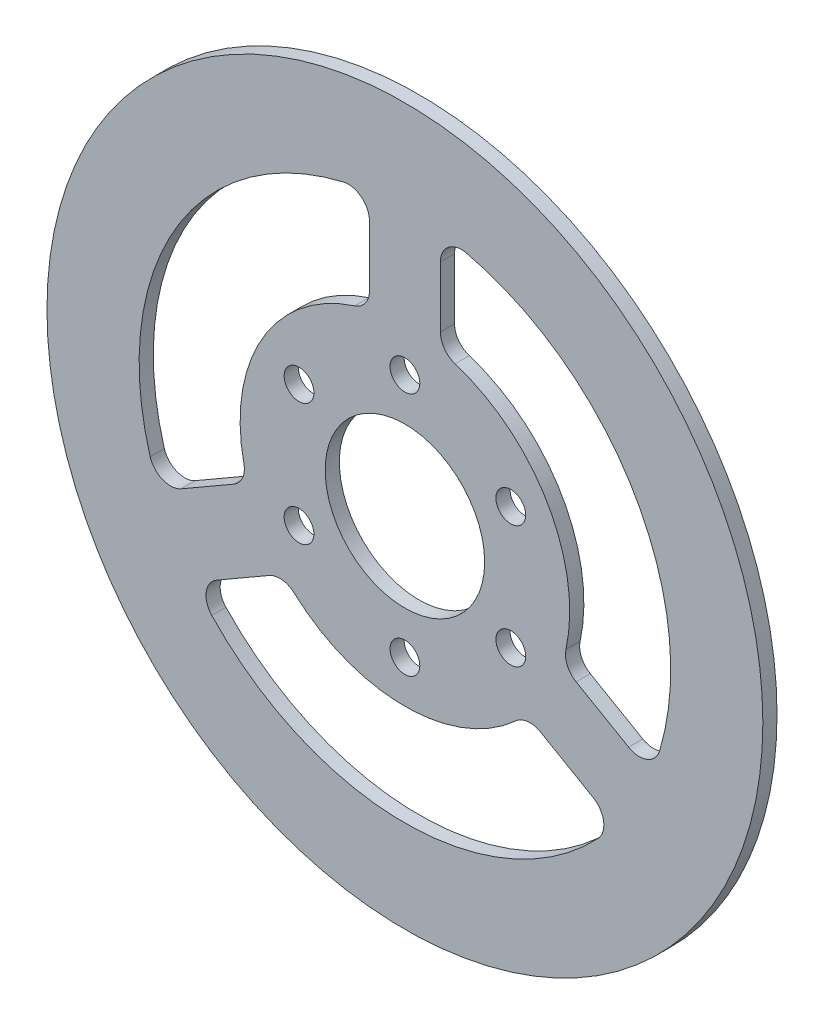
ISO-10303-21;
HEADER;
FILE_DESCRIPTION(('STEP AP214'),'2;1');
FILE_NAME('part.step','',(''),(''),'','','');
FILE_SCHEMA(('AUTOMOTIVE_DESIGN { 1 0 10303 214 1 1 1 1 }'));
ENDSEC;
DATA;
#1=APPLICATION_CONTEXT('core data for automotive mechanical design processes');
#2=APPLICATION_PROTOCOL_DEFINITION('international standard','automotive_design',2000,#1);
#3=PRODUCT_CONTEXT('',#1,'mechanical');
#4=PRODUCT('Part','Part','',(#3));
#5=PRODUCT_RELATED_PRODUCT_CATEGORY('part','',(#4));
#6=PRODUCT_DEFINITION_FORMATION('','',#4);
#7=PRODUCT_DEFINITION_CONTEXT('part definition',#1,'design');
#8=PRODUCT_DEFINITION('design','',#6,#7);
#9=PRODUCT_DEFINITION_SHAPE('','',#8);
#10=(LENGTH_UNIT() NAMED_UNIT(*) SI_UNIT(.MILLI.,.METRE.));
#11=(NAMED_UNIT(*) PLANE_ANGLE_UNIT() SI_UNIT($,.RADIAN.));
#12=(NAMED_UNIT(*) SI_UNIT($,.STERADIAN.) SOLID_ANGLE_UNIT());
#13=UNCERTAINTY_MEASURE_WITH_UNIT(LENGTH_MEASURE(1.E-05),#10,'distance_accuracy_value','');
#14=(GEOMETRIC_REPRESENTATION_CONTEXT(3) GLOBAL_UNCERTAINTY_ASSIGNED_CONTEXT((#13)) GLOBAL_UNIT_ASSIGNED_CONTEXT((#10,
#11,#12)) REPRESENTATION_CONTEXT('',''));
#15=CARTESIAN_POINT('',(0.,0.,0.));
#16=DIRECTION('',(0.,0.,1.));
#17=DIRECTION('',(1.,0.,0.));
#18=AXIS2_PLACEMENT_3D('',#15,#16,#17);
#19=CARTESIAN_POINT('',(0.,0.,2.));
#20=DIRECTION('',(0.,0.,1.));
#21=DIRECTION('',(1.,0.,0.));
#22=AXIS2_PLACEMENT_3D('',#19,#20,#21);
#23=PLANE('',#22);
#24=CARTESIAN_POINT('',(14.9389382152816,-8.62499999999999,2.));
#25=DIRECTION('',(0.,0.,1.));
#26=DIRECTION('',(1.,0.,0.));
#27=AXIS2_PLACEMENT_3D('',#24,#25,#26);
#28=CIRCLE('',#27,2.1);
#29=CARTESIAN_POINT('',(17.0389382152816,-8.62499999999999,2.));
#30=VERTEX_POINT('',#29);
#31=EDGE_CURVE('E709',#30,#30,#28,.T.);
#32=ORIENTED_EDGE('',*,*,#31,.F.);
#33=EDGE_LOOP('',(#32));
#34=FACE_BOUND('',#33,.T.);
#35=CARTESIAN_POINT('',(14.9389382152816,8.625,2.));
#36=DIRECTION('',(0.,0.,1.));
#37=DIRECTION('',(1.,0.,0.));
#38=AXIS2_PLACEMENT_3D('',#35,#36,#37);
#39=CIRCLE('',#38,2.1);
#40=CARTESIAN_POINT('',(17.0389382152816,8.625,2.));
#41=VERTEX_POINT('',#40);
#42=EDGE_CURVE('E712',#41,#41,#39,.T.);
#43=ORIENTED_EDGE('',*,*,#42,.F.);
#44=EDGE_LOOP('',(#43));
#45=FACE_BOUND('',#44,.T.);
#46=CARTESIAN_POINT('',(0.,17.25,2.));
#47=DIRECTION('',(0.,0.,1.));
#48=DIRECTION('',(1.,0.,0.));
#49=AXIS2_PLACEMENT_3D('',#46,#47,#48);
#50=CIRCLE('',#49,2.1);
#51=CARTESIAN_POINT('',(2.1,17.25,2.));
#52=VERTEX_POINT('',#51);
#53=EDGE_CURVE('E716',#52,#52,#50,.T.);
#54=ORIENTED_EDGE('',*,*,#53,.F.);
#55=EDGE_LOOP('',(#54));
#56=FACE_BOUND('',#55,.T.);
#57=CARTESIAN_POINT('',(-14.9389382152816,8.62499999999999,2.));
#58=DIRECTION('',(0.,0.,1.));
#59=DIRECTION('',(1.,0.,0.));
#60=AXIS2_PLACEMENT_3D('',#57,#58,#59);
#61=CIRCLE('',#60,2.1);
#62=CARTESIAN_POINT('',(-12.8389382152816,8.62499999999999,2.));
#63=VERTEX_POINT('',#62);
#64=EDGE_CURVE('E706',#63,#63,#61,.T.);
#65=ORIENTED_EDGE('',*,*,#64,.F.);
#66=EDGE_LOOP('',(#65));
#67=FACE_BOUND('',#66,.T.);
#68=CARTESIAN_POINT('',(0.,0.,2.));
#69=DIRECTION('',(0.,0.,1.));
#70=DIRECTION('',(1.,0.,0.));
#71=AXIS2_PLACEMENT_3D('',#68,#69,#70);
#72=CIRCLE('',#71,11.25);
#73=CARTESIAN_POINT('',(11.25,0.,2.));
#74=VERTEX_POINT('',#73);
#75=EDGE_CURVE('E698',#74,#74,#72,.T.);
#76=ORIENTED_EDGE('',*,*,#75,.F.);
#77=EDGE_LOOP('',(#76));
#78=FACE_BOUND('',#77,.T.);
#79=CARTESIAN_POINT('',(-14.9389382152816,-8.62500000000001,2.));
#80=DIRECTION('',(0.,0.,1.));
#81=DIRECTION('',(1.,0.,0.));
#82=AXIS2_PLACEMENT_3D('',#79,#80,#81);
#83=CIRCLE('',#82,2.1);
#84=CARTESIAN_POINT('',(-12.8389382152816,-8.62500000000001,2.));
#85=VERTEX_POINT('',#84);
#86=EDGE_CURVE('E703',#85,#85,#83,.T.);
#87=ORIENTED_EDGE('',*,*,#86,.F.);
#88=EDGE_LOOP('',(#87));
#89=FACE_BOUND('',#88,.T.);
#90=CARTESIAN_POINT('',(0.,-17.25,2.));
#91=DIRECTION('',(0.,0.,1.));
#92=DIRECTION('',(1.,0.,0.));
#93=AXIS2_PLACEMENT_3D('',#90,#91,#92);
#94=CIRCLE('',#93,2.1);
#95=CARTESIAN_POINT('',(2.1,-17.25,2.));
#96=VERTEX_POINT('',#95);
#97=EDGE_CURVE('E713',#96,#96,#94,.T.);
#98=ORIENTED_EDGE('',*,*,#97,.F.);
#99=EDGE_LOOP('',(#98));
#100=FACE_BOUND('',#99,.T.);
#101=CARTESIAN_POINT('',(0.,0.,2.));
#102=DIRECTION('',(0.,0.,1.));
#103=DIRECTION('',(1.,0.,0.));
#104=AXIS2_PLACEMENT_3D('',#101,#102,#103);
#105=CIRCLE('',#104,50.5);
#106=CARTESIAN_POINT('',(50.5,0.,2.));
#107=VERTEX_POINT('',#106);
#108=EDGE_CURVE('E476',#107,#107,#105,.T.);
#109=ORIENTED_EDGE('',*,*,#108,.T.);
#110=EDGE_LOOP('',(#109));
#111=FACE_BOUND('',#110,.T.);
#112=CARTESIAN_POINT('',(0.,0.,2.));
#113=DIRECTION('',(0.,0.,1.));
#114=DIRECTION('',(1.,0.,0.));
#115=AXIS2_PLACEMENT_3D('',#112,#113,#114);
#116=CIRCLE('',#115,37.5);
#117=CARTESIAN_POINT('',(-8.69565217391304,36.477878683804,2.));
#118=VERTEX_POINT('',#117);
#119=CARTESIAN_POINT('',(-35.9385957032976,-10.7082836568199,2.));
#120=VERTEX_POINT('',#119);
#121=EDGE_CURVE('E544',#118,#120,#116,.T.);
#122=ORIENTED_EDGE('',*,*,#121,.F.);
#123=CARTESIAN_POINT('',(-8.,33.5596483890997,2.));
#124=DIRECTION('',(0.,0.,1.));
#125=DIRECTION('',(1.,0.,0.));
#126=AXIS2_PLACEMENT_3D('',#123,#124,#125);
#127=CIRCLE('',#126,3.);
#128=CARTESIAN_POINT('',(-5.,33.5596483890997,2.));
#129=VERTEX_POINT('',#128);
#130=EDGE_CURVE('E347',#118,#129,#127,.F.);
#131=ORIENTED_EDGE('',*,*,#130,.T.);
#132=DIRECTION('',(0.,-1.,0.));
#133=VECTOR('',#132,1.);
#134=CARTESIAN_POINT('',(-5.,0.,2.));
#135=LINE('',#134,#133);
#136=CARTESIAN_POINT('',(-5.,25.0012499687516,2.));
#137=VERTEX_POINT('',#136);
#138=EDGE_CURVE('E541',#129,#137,#135,.T.);
#139=ORIENTED_EDGE('',*,*,#138,.T.);
#140=CARTESIAN_POINT('',(-8.,25.0012499687516,2.));
#141=DIRECTION('',(0.,0.,1.));
#142=DIRECTION('',(1.,0.,0.));
#143=AXIS2_PLACEMENT_3D('',#140,#141,#142);
#144=CIRCLE('',#143,3.);
#145=CARTESIAN_POINT('',(-7.08571428571429,22.1439642580371,2.));
#146=VERTEX_POINT('',#145);
#147=EDGE_CURVE('E329',#137,#146,#144,.F.);
#148=ORIENTED_EDGE('',*,*,#147,.T.);
#149=CARTESIAN_POINT('',(0.,0.,2.));
#150=DIRECTION('',(0.,0.,1.));
#151=DIRECTION('',(1.,0.,0.));
#152=AXIS2_PLACEMENT_3D('',#149,#150,#151);
#153=CIRCLE('',#152,23.25);
#154=CARTESIAN_POINT('',(-22.7200927308119,-4.93557355363168,2.));
#155=VERTEX_POINT('',#154);
#156=EDGE_CURVE('E501',#146,#155,#153,.T.);
#157=ORIENTED_EDGE('',*,*,#156,.T.);
#158=CARTESIAN_POINT('',(-25.6517175993038,-5.57242175410028,2.));
#159=DIRECTION('',(0.,0.,1.));
#160=DIRECTION('',(1.,0.,0.));
#161=AXIS2_PLACEMENT_3D('',#158,#159,#160);
#162=CIRCLE('',#161,3.);
#163=CARTESIAN_POINT('',(-24.1517175993038,-8.1704979654536,2.));
#164=VERTEX_POINT('',#163);
#165=EDGE_CURVE('E339',#155,#164,#162,.F.);
#166=ORIENTED_EDGE('',*,*,#165,.T.);
#167=DIRECTION('',(0.866025403784438,0.500000000000001,0.));
#168=VECTOR('',#167,1.);
#169=CARTESIAN_POINT('',(-2.50000000000001,4.3301270189222,2.));
#170=LINE('',#169,#168);
#171=CARTESIAN_POINT('',(-31.5635080470338,-12.4496971756277,2.));
#172=VERTEX_POINT('',#171);
#173=EDGE_CURVE('E548',#172,#164,#170,.T.);
#174=ORIENTED_EDGE('',*,*,#173,.F.);
#175=CARTESIAN_POINT('',(-33.0635080470338,-9.85162096427434,2.));
#176=DIRECTION('',(0.,0.,1.));
#177=DIRECTION('',(1.,0.,0.));
#178=AXIS2_PLACEMENT_3D('',#175,#176,#177);
#179=CIRCLE('',#178,3.);
#180=EDGE_CURVE('E343',#172,#120,#179,.F.);
#181=ORIENTED_EDGE('',*,*,#180,.T.);
#182=EDGE_LOOP('',(#122,#131,#139,#148,#157,#166,#174,#181));
#183=FACE_BOUND('',#182,.T.);
#184=CARTESIAN_POINT('',(0.,0.,2.));
#185=DIRECTION('',(0.,0.,1.));
#186=DIRECTION('',(1.,0.,0.));
#187=AXIS2_PLACEMENT_3D('',#184,#185,#186);
#188=CIRCLE('',#187,37.5);
#189=CARTESIAN_POINT('',(-27.2429435293846,-25.7695950269841,2.));
#190=VERTEX_POINT('',#189);
#191=CARTESIAN_POINT('',(27.2429435293846,-25.7695950269841,2.));
#192=VERTEX_POINT('',#191);
#193=EDGE_CURVE('E537',#190,#192,#188,.T.);
#194=ORIENTED_EDGE('',*,*,#193,.F.);
#195=CARTESIAN_POINT('',(-25.0635080470338,-23.7080274248254,2.));
#196=DIRECTION('',(0.,0.,1.));
#197=DIRECTION('',(1.,0.,0.));
#198=AXIS2_PLACEMENT_3D('',#195,#196,#197);
#199=CIRCLE('',#198,3.);
#200=CARTESIAN_POINT('',(-26.5635080470338,-21.109951213472,2.));
#201=VERTEX_POINT('',#200);
#202=EDGE_CURVE('E363',#190,#201,#199,.F.);
#203=ORIENTED_EDGE('',*,*,#202,.T.);
#204=DIRECTION('',(0.866025403784438,0.500000000000001,0.));
#205=VECTOR('',#204,1.);
#206=CARTESIAN_POINT('',(2.5,-4.33012701892218,2.));
#207=LINE('',#206,#205);
#208=CARTESIAN_POINT('',(-19.1517175993038,-16.830752003298,2.));
#209=VERTEX_POINT('',#208);
#210=EDGE_CURVE('E528',#201,#209,#207,.T.);
#211=ORIENTED_EDGE('',*,*,#210,.T.);
#212=CARTESIAN_POINT('',(-17.6517175993038,-19.4288282146513,2.));
#213=DIRECTION('',(0.,0.,1.));
#214=DIRECTION('',(1.,0.,0.));
#215=AXIS2_PLACEMENT_3D('',#212,#213,#214);
#216=CIRCLE('',#215,3.);
#217=CARTESIAN_POINT('',(-15.6343784450976,-17.2083907044054,2.));
#218=VERTEX_POINT('',#217);
#219=EDGE_CURVE('E351',#209,#218,#216,.F.);
#220=ORIENTED_EDGE('',*,*,#219,.T.);
#221=CARTESIAN_POINT('',(0.,0.,2.));
#222=DIRECTION('',(0.,0.,1.));
#223=DIRECTION('',(1.,0.,0.));
#224=AXIS2_PLACEMENT_3D('',#221,#222,#223);
#225=CIRCLE('',#224,23.25);
#226=CARTESIAN_POINT('',(15.6343784450976,-17.2083907044054,2.));
#227=VERTEX_POINT('',#226);
#228=EDGE_CURVE('E527',#218,#227,#225,.T.);
#229=ORIENTED_EDGE('',*,*,#228,.T.);
#230=CARTESIAN_POINT('',(17.6517175993038,-19.4288282146513,2.));
#231=DIRECTION('',(0.,0.,1.));
#232=DIRECTION('',(1.,0.,0.));
#233=AXIS2_PLACEMENT_3D('',#230,#231,#232);
#234=CIRCLE('',#233,3.);
#235=CARTESIAN_POINT('',(19.1517175993038,-16.830752003298,2.));
#236=VERTEX_POINT('',#235);
#237=EDGE_CURVE('E355',#227,#236,#234,.F.);
#238=ORIENTED_EDGE('',*,*,#237,.T.);
#239=DIRECTION('',(-0.866025403784439,0.5,0.));
#240=VECTOR('',#239,1.);
#241=CARTESIAN_POINT('',(-2.5,-4.3301270189222,2.));
#242=LINE('',#241,#240);
#243=CARTESIAN_POINT('',(26.5635080470338,-21.109951213472,2.));
#244=VERTEX_POINT('',#243);
#245=EDGE_CURVE('E533',#244,#236,#242,.T.);
#246=ORIENTED_EDGE('',*,*,#245,.F.);
#247=CARTESIAN_POINT('',(25.0635080470338,-23.7080274248253,2.));
#248=DIRECTION('',(0.,0.,1.));
#249=DIRECTION('',(1.,0.,0.));
#250=AXIS2_PLACEMENT_3D('',#247,#248,#249);
#251=CIRCLE('',#250,3.);
#252=EDGE_CURVE('E359',#244,#192,#251,.F.);
#253=ORIENTED_EDGE('',*,*,#252,.T.);
#254=EDGE_LOOP('',(#194,#203,#211,#220,#229,#238,#246,#253));
#255=FACE_BOUND('',#254,.T.);
#256=CARTESIAN_POINT('',(0.,0.,2.));
#257=DIRECTION('',(0.,0.,1.));
#258=DIRECTION('',(1.,0.,0.));
#259=AXIS2_PLACEMENT_3D('',#256,#257,#258);
#260=CIRCLE('',#259,37.5);
#261=CARTESIAN_POINT('',(35.9385957032976,-10.7082836568199,2.));
#262=VERTEX_POINT('',#261);
#263=CARTESIAN_POINT('',(8.69565217391304,36.477878683804,2.));
#264=VERTEX_POINT('',#263);
#265=EDGE_CURVE('E369',#262,#264,#260,.T.);
#266=ORIENTED_EDGE('',*,*,#265,.F.);
#267=CARTESIAN_POINT('',(33.0635080470338,-9.85162096427431,2.));
#268=DIRECTION('',(0.,0.,1.));
#269=DIRECTION('',(1.,0.,0.));
#270=AXIS2_PLACEMENT_3D('',#267,#268,#269);
#271=CIRCLE('',#270,3.);
#272=CARTESIAN_POINT('',(31.5635080470338,-12.4496971756276,2.));
#273=VERTEX_POINT('',#272);
#274=EDGE_CURVE('E330',#262,#273,#271,.F.);
#275=ORIENTED_EDGE('',*,*,#274,.T.);
#276=DIRECTION('',(-0.866025403784439,0.5,0.));
#277=VECTOR('',#276,1.);
#278=CARTESIAN_POINT('',(2.5,4.33012701892219,2.));
#279=LINE('',#278,#277);
#280=CARTESIAN_POINT('',(24.1517175993038,-8.17049796545358,2.));
#281=VERTEX_POINT('',#280);
#282=EDGE_CURVE('E310',#273,#281,#279,.T.);
#283=ORIENTED_EDGE('',*,*,#282,.T.);
#284=CARTESIAN_POINT('',(25.6517175993038,-5.57242175410026,2.));
#285=DIRECTION('',(0.,0.,1.));
#286=DIRECTION('',(1.,0.,0.));
#287=AXIS2_PLACEMENT_3D('',#284,#285,#286);
#288=CIRCLE('',#287,3.);
#289=CARTESIAN_POINT('',(22.7200927308119,-4.93557355363166,2.));
#290=VERTEX_POINT('',#289);
#291=EDGE_CURVE('E427',#281,#290,#288,.F.);
#292=ORIENTED_EDGE('',*,*,#291,.T.);
#293=CARTESIAN_POINT('',(0.,0.,2.));
#294=DIRECTION('',(0.,0.,1.));
#295=DIRECTION('',(1.,0.,0.));
#296=AXIS2_PLACEMENT_3D('',#293,#294,#295);
#297=CIRCLE('',#296,23.25);
#298=CARTESIAN_POINT('',(7.08571428571429,22.1439642580371,2.));
#299=VERTEX_POINT('',#298);
#300=EDGE_CURVE('E545',#290,#299,#297,.T.);
#301=ORIENTED_EDGE('',*,*,#300,.T.);
#302=CARTESIAN_POINT('',(8.,25.0012499687516,2.));
#303=DIRECTION('',(0.,0.,1.));
#304=DIRECTION('',(1.,0.,0.));
#305=AXIS2_PLACEMENT_3D('',#302,#303,#304);
#306=CIRCLE('',#305,3.);
#307=CARTESIAN_POINT('',(5.,25.0012499687516,2.));
#308=VERTEX_POINT('',#307);
#309=EDGE_CURVE('E430',#299,#308,#306,.F.);
#310=ORIENTED_EDGE('',*,*,#309,.T.);
#311=DIRECTION('',(0.,-1.,0.));
#312=VECTOR('',#311,1.);
#313=CARTESIAN_POINT('',(5.,0.,2.));
#314=LINE('',#313,#312);
#315=CARTESIAN_POINT('',(5.,33.5596483890997,2.));
#316=VERTEX_POINT('',#315);
#317=EDGE_CURVE('E371',#316,#308,#314,.T.);
#318=ORIENTED_EDGE('',*,*,#317,.F.);
#319=CARTESIAN_POINT('',(8.,33.5596483890997,2.));
#320=DIRECTION('',(0.,0.,1.));
#321=DIRECTION('',(1.,0.,0.));
#322=AXIS2_PLACEMENT_3D('',#319,#320,#321);
#323=CIRCLE('',#322,3.);
#324=EDGE_CURVE('E148',#316,#264,#323,.F.);
#325=ORIENTED_EDGE('',*,*,#324,.T.);
#326=EDGE_LOOP('',(#266,#275,#283,#292,#301,#310,#318,#325));
#327=FACE_BOUND('',#326,.T.);
#328=ADVANCED_FACE('F140',(#34,#45,#56,#67,#78,#89,#100,#111,#183,#255,#327),#23,.T.);
#329=CARTESIAN_POINT('',(0.,0.,0.));
#330=DIRECTION('',(0.,0.,1.));
#331=DIRECTION('',(1.,0.,0.));
#332=AXIS2_PLACEMENT_3D('',#329,#330,#331);
#333=PLANE('',#332);
#334=CARTESIAN_POINT('',(14.9389382152816,-8.62499999999999,0.));
#335=DIRECTION('',(0.,0.,1.));
#336=DIRECTION('',(1.,0.,0.));
#337=AXIS2_PLACEMENT_3D('',#334,#335,#336);
#338=CIRCLE('',#337,2.1);
#339=CARTESIAN_POINT('',(17.0389382152816,-8.62499999999999,0.));
#340=VERTEX_POINT('',#339);
#341=EDGE_CURVE('E470',#340,#340,#338,.T.);
#342=ORIENTED_EDGE('',*,*,#341,.T.);
#343=EDGE_LOOP('',(#342));
#344=FACE_BOUND('',#343,.T.);
#345=CARTESIAN_POINT('',(14.9389382152816,8.625,0.));
#346=DIRECTION('',(0.,0.,1.));
#347=DIRECTION('',(1.,0.,0.));
#348=AXIS2_PLACEMENT_3D('',#345,#346,#347);
#349=CIRCLE('',#348,2.1);
#350=CARTESIAN_POINT('',(17.0389382152816,8.625,0.));
#351=VERTEX_POINT('',#350);
#352=EDGE_CURVE('E467',#351,#351,#349,.T.);
#353=ORIENTED_EDGE('',*,*,#352,.T.);
#354=EDGE_LOOP('',(#353));
#355=FACE_BOUND('',#354,.T.);
#356=CARTESIAN_POINT('',(0.,17.25,0.));
#357=DIRECTION('',(0.,0.,1.));
#358=DIRECTION('',(1.,0.,0.));
#359=AXIS2_PLACEMENT_3D('',#356,#357,#358);
#360=CIRCLE('',#359,2.1);
#361=CARTESIAN_POINT('',(2.1,17.25,0.));
#362=VERTEX_POINT('',#361);
#363=EDGE_CURVE('E463',#362,#362,#360,.T.);
#364=ORIENTED_EDGE('',*,*,#363,.T.);
#365=EDGE_LOOP('',(#364));
#366=FACE_BOUND('',#365,.T.);
#367=CARTESIAN_POINT('',(-14.9389382152816,8.62499999999999,0.));
#368=DIRECTION('',(0.,0.,1.));
#369=DIRECTION('',(1.,0.,0.));
#370=AXIS2_PLACEMENT_3D('',#367,#368,#369);
#371=CIRCLE('',#370,2.1);
#372=CARTESIAN_POINT('',(-12.8389382152816,8.62499999999999,0.));
#373=VERTEX_POINT('',#372);
#374=EDGE_CURVE('E460',#373,#373,#371,.T.);
#375=ORIENTED_EDGE('',*,*,#374,.T.);
#376=EDGE_LOOP('',(#375));
#377=FACE_BOUND('',#376,.T.);
#378=DIRECTION('',(0.866025403784438,0.500000000000001,0.));
#379=VECTOR('',#378,1.);
#380=CARTESIAN_POINT('',(2.5,-4.33012701892218,0.));
#381=LINE('',#380,#379);
#382=CARTESIAN_POINT('',(-26.5635080470338,-21.109951213472,0.));
#383=VERTEX_POINT('',#382);
#384=CARTESIAN_POINT('',(-19.1517175993038,-16.830752003298,0.));
#385=VERTEX_POINT('',#384);
#386=EDGE_CURVE('E456',#383,#385,#381,.T.);
#387=ORIENTED_EDGE('',*,*,#386,.F.);
#388=CARTESIAN_POINT('',(-25.0635080470338,-23.7080274248254,0.));
#389=DIRECTION('',(0.,0.,1.));
#390=DIRECTION('',(1.,0.,0.));
#391=AXIS2_PLACEMENT_3D('',#388,#389,#390);
#392=CIRCLE('',#391,3.);
#393=CARTESIAN_POINT('',(-27.2429435293846,-25.7695950269841,0.));
#394=VERTEX_POINT('',#393);
#395=EDGE_CURVE('E162',#383,#394,#392,.T.);
#396=ORIENTED_EDGE('',*,*,#395,.T.);
#397=CARTESIAN_POINT('',(0.,0.,0.));
#398=DIRECTION('',(0.,0.,1.));
#399=DIRECTION('',(1.,0.,0.));
#400=AXIS2_PLACEMENT_3D('',#397,#398,#399);
#401=CIRCLE('',#400,37.5);
#402=CARTESIAN_POINT('',(27.2429435293846,-25.7695950269841,0.));
#403=VERTEX_POINT('',#402);
#404=EDGE_CURVE('E496',#394,#403,#401,.T.);
#405=ORIENTED_EDGE('',*,*,#404,.T.);
#406=CARTESIAN_POINT('',(25.0635080470338,-23.7080274248253,0.));
#407=DIRECTION('',(0.,0.,1.));
#408=DIRECTION('',(1.,0.,0.));
#409=AXIS2_PLACEMENT_3D('',#406,#407,#408);
#410=CIRCLE('',#409,3.);
#411=CARTESIAN_POINT('',(26.5635080470338,-21.109951213472,0.));
#412=VERTEX_POINT('',#411);
#413=EDGE_CURVE('E361',#403,#412,#410,.T.);
#414=ORIENTED_EDGE('',*,*,#413,.T.);
#415=DIRECTION('',(-0.866025403784439,0.5,0.));
#416=VECTOR('',#415,1.);
#417=CARTESIAN_POINT('',(-2.5,-4.3301270189222,0.));
#418=LINE('',#417,#416);
#419=CARTESIAN_POINT('',(19.1517175993038,-16.830752003298,0.));
#420=VERTEX_POINT('',#419);
#421=EDGE_CURVE('E507',#412,#420,#418,.T.);
#422=ORIENTED_EDGE('',*,*,#421,.T.);
#423=CARTESIAN_POINT('',(17.6517175993038,-19.4288282146513,0.));
#424=DIRECTION('',(0.,0.,1.));
#425=DIRECTION('',(1.,0.,0.));
#426=AXIS2_PLACEMENT_3D('',#423,#424,#425);
#427=CIRCLE('',#426,3.);
#428=CARTESIAN_POINT('',(15.6343784450976,-17.2083907044054,0.));
#429=VERTEX_POINT('',#428);
#430=EDGE_CURVE('E357',#420,#429,#427,.T.);
#431=ORIENTED_EDGE('',*,*,#430,.T.);
#432=CARTESIAN_POINT('',(0.,0.,0.));
#433=DIRECTION('',(0.,0.,1.));
#434=DIRECTION('',(1.,0.,0.));
#435=AXIS2_PLACEMENT_3D('',#432,#433,#434);
#436=CIRCLE('',#435,23.25);
#437=CARTESIAN_POINT('',(-15.6343784450976,-17.2083907044054,0.));
#438=VERTEX_POINT('',#437);
#439=EDGE_CURVE('E510',#438,#429,#436,.T.);
#440=ORIENTED_EDGE('',*,*,#439,.F.);
#441=CARTESIAN_POINT('',(-17.6517175993038,-19.4288282146513,0.));
#442=DIRECTION('',(0.,0.,1.));
#443=DIRECTION('',(1.,0.,0.));
#444=AXIS2_PLACEMENT_3D('',#441,#442,#443);
#445=CIRCLE('',#444,3.);
#446=EDGE_CURVE('E353',#438,#385,#445,.T.);
#447=ORIENTED_EDGE('',*,*,#446,.T.);
#448=EDGE_LOOP('',(#387,#396,#405,#414,#422,#431,#440,#447));
#449=FACE_BOUND('',#448,.T.);
#450=CARTESIAN_POINT('',(0.,0.,0.));
#451=DIRECTION('',(0.,0.,1.));
#452=DIRECTION('',(1.,0.,0.));
#453=AXIS2_PLACEMENT_3D('',#450,#451,#452);
#454=CIRCLE('',#453,11.25);
#455=CARTESIAN_POINT('',(11.25,0.,0.));
#456=VERTEX_POINT('',#455);
#457=EDGE_CURVE('E464',#456,#456,#454,.T.);
#458=ORIENTED_EDGE('',*,*,#457,.T.);
#459=EDGE_LOOP('',(#458));
#460=FACE_BOUND('',#459,.T.);
#461=CARTESIAN_POINT('',(-14.9389382152816,-8.62500000000001,0.));
#462=DIRECTION('',(0.,0.,1.));
#463=DIRECTION('',(1.,0.,0.));
#464=AXIS2_PLACEMENT_3D('',#461,#462,#463);
#465=CIRCLE('',#464,2.1);
#466=CARTESIAN_POINT('',(-12.8389382152816,-8.62500000000001,0.));
#467=VERTEX_POINT('',#466);
#468=EDGE_CURVE('E500',#467,#467,#465,.T.);
#469=ORIENTED_EDGE('',*,*,#468,.T.);
#470=EDGE_LOOP('',(#469));
#471=FACE_BOUND('',#470,.T.);
#472=CARTESIAN_POINT('',(0.,-17.25,0.));
#473=DIRECTION('',(0.,0.,1.));
#474=DIRECTION('',(1.,0.,0.));
#475=AXIS2_PLACEMENT_3D('',#472,#473,#474);
#476=CIRCLE('',#475,2.1);
#477=CARTESIAN_POINT('',(2.1,-17.25,0.));
#478=VERTEX_POINT('',#477);
#479=EDGE_CURVE('E497',#478,#478,#476,.T.);
#480=ORIENTED_EDGE('',*,*,#479,.T.);
#481=EDGE_LOOP('',(#480));
#482=FACE_BOUND('',#481,.T.);
#483=CARTESIAN_POINT('',(0.,0.,0.));
#484=DIRECTION('',(0.,0.,1.));
#485=DIRECTION('',(1.,0.,0.));
#486=AXIS2_PLACEMENT_3D('',#483,#484,#485);
#487=CIRCLE('',#486,50.5);
#488=CARTESIAN_POINT('',(50.5,0.,0.));
#489=VERTEX_POINT('',#488);
#490=EDGE_CURVE('E472',#489,#489,#487,.T.);
#491=ORIENTED_EDGE('',*,*,#490,.F.);
#492=EDGE_LOOP('',(#491));
#493=FACE_BOUND('',#492,.T.);
#494=DIRECTION('',(0.,-1.,0.));
#495=VECTOR('',#494,1.);
#496=CARTESIAN_POINT('',(-5.,0.,0.));
#497=LINE('',#496,#495);
#498=CARTESIAN_POINT('',(-5.,33.5596483890997,0.));
#499=VERTEX_POINT('',#498);
#500=CARTESIAN_POINT('',(-5.,25.0012499687516,0.));
#501=VERTEX_POINT('',#500);
#502=EDGE_CURVE('E493',#499,#501,#497,.T.);
#503=ORIENTED_EDGE('',*,*,#502,.F.);
#504=CARTESIAN_POINT('',(-8.,33.5596483890997,0.));
#505=DIRECTION('',(0.,0.,1.));
#506=DIRECTION('',(1.,0.,0.));
#507=AXIS2_PLACEMENT_3D('',#504,#505,#506);
#508=CIRCLE('',#507,3.);
#509=CARTESIAN_POINT('',(-8.69565217391304,36.477878683804,0.));
#510=VERTEX_POINT('',#509);
#511=EDGE_CURVE('E349',#499,#510,#508,.T.);
#512=ORIENTED_EDGE('',*,*,#511,.T.);
#513=CARTESIAN_POINT('',(0.,0.,0.));
#514=DIRECTION('',(0.,0.,1.));
#515=DIRECTION('',(1.,0.,0.));
#516=AXIS2_PLACEMENT_3D('',#513,#514,#515);
#517=CIRCLE('',#516,37.5);
#518=CARTESIAN_POINT('',(-35.9385957032976,-10.7082836568199,0.));
#519=VERTEX_POINT('',#518);
#520=EDGE_CURVE('E481',#510,#519,#517,.T.);
#521=ORIENTED_EDGE('',*,*,#520,.T.);
#522=CARTESIAN_POINT('',(-33.0635080470338,-9.85162096427434,0.));
#523=DIRECTION('',(0.,0.,1.));
#524=DIRECTION('',(1.,0.,0.));
#525=AXIS2_PLACEMENT_3D('',#522,#523,#524);
#526=CIRCLE('',#525,3.);
#527=CARTESIAN_POINT('',(-31.5635080470338,-12.4496971756277,0.));
#528=VERTEX_POINT('',#527);
#529=EDGE_CURVE('E345',#519,#528,#526,.T.);
#530=ORIENTED_EDGE('',*,*,#529,.T.);
#531=DIRECTION('',(0.866025403784438,0.500000000000001,0.));
#532=VECTOR('',#531,1.);
#533=CARTESIAN_POINT('',(-2.50000000000001,4.3301270189222,0.));
#534=LINE('',#533,#532);
#535=CARTESIAN_POINT('',(-24.1517175993038,-8.1704979654536,0.));
#536=VERTEX_POINT('',#535);
#537=EDGE_CURVE('E487',#528,#536,#534,.T.);
#538=ORIENTED_EDGE('',*,*,#537,.T.);
#539=CARTESIAN_POINT('',(-25.6517175993038,-5.57242175410028,0.));
#540=DIRECTION('',(0.,0.,1.));
#541=DIRECTION('',(1.,0.,0.));
#542=AXIS2_PLACEMENT_3D('',#539,#540,#541);
#543=CIRCLE('',#542,3.);
#544=CARTESIAN_POINT('',(-22.7200927308119,-4.93557355363168,0.));
#545=VERTEX_POINT('',#544);
#546=EDGE_CURVE('E341',#536,#545,#543,.T.);
#547=ORIENTED_EDGE('',*,*,#546,.T.);
#548=CARTESIAN_POINT('',(0.,0.,0.));
#549=DIRECTION('',(0.,0.,1.));
#550=DIRECTION('',(1.,0.,0.));
#551=AXIS2_PLACEMENT_3D('',#548,#549,#550);
#552=CIRCLE('',#551,23.25);
#553=CARTESIAN_POINT('',(-7.08571428571429,22.1439642580371,0.));
#554=VERTEX_POINT('',#553);
#555=EDGE_CURVE('E490',#554,#545,#552,.T.);
#556=ORIENTED_EDGE('',*,*,#555,.F.);
#557=CARTESIAN_POINT('',(-8.,25.0012499687516,0.));
#558=DIRECTION('',(0.,0.,1.));
#559=DIRECTION('',(1.,0.,0.));
#560=AXIS2_PLACEMENT_3D('',#557,#558,#559);
#561=CIRCLE('',#560,3.);
#562=EDGE_CURVE('E332',#554,#501,#561,.T.);
#563=ORIENTED_EDGE('',*,*,#562,.T.);
#564=EDGE_LOOP('',(#503,#512,#521,#530,#538,#547,#556,#563));
#565=FACE_BOUND('',#564,.T.);
#566=DIRECTION('',(-0.866025403784439,0.5,0.));
#567=VECTOR('',#566,1.);
#568=CARTESIAN_POINT('',(2.5,4.33012701892219,0.));
#569=LINE('',#568,#567);
#570=CARTESIAN_POINT('',(31.5635080470338,-12.4496971756276,0.));
#571=VERTEX_POINT('',#570);
#572=CARTESIAN_POINT('',(24.1517175993038,-8.17049796545358,0.));
#573=VERTEX_POINT('',#572);
#574=EDGE_CURVE('E307',#571,#573,#569,.T.);
#575=ORIENTED_EDGE('',*,*,#574,.F.);
#576=CARTESIAN_POINT('',(33.0635080470338,-9.85162096427431,0.));
#577=DIRECTION('',(0.,0.,1.));
#578=DIRECTION('',(1.,0.,0.));
#579=AXIS2_PLACEMENT_3D('',#576,#577,#578);
#580=CIRCLE('',#579,3.);
#581=CARTESIAN_POINT('',(35.9385957032976,-10.7082836568199,0.));
#582=VERTEX_POINT('',#581);
#583=EDGE_CURVE('E318',#571,#582,#580,.T.);
#584=ORIENTED_EDGE('',*,*,#583,.T.);
#585=CARTESIAN_POINT('',(0.,0.,0.));
#586=DIRECTION('',(0.,0.,1.));
#587=DIRECTION('',(1.,0.,0.));
#588=AXIS2_PLACEMENT_3D('',#585,#586,#587);
#589=CIRCLE('',#588,37.5);
#590=CARTESIAN_POINT('',(8.69565217391304,36.477878683804,0.));
#591=VERTEX_POINT('',#590);
#592=EDGE_CURVE('E454',#582,#591,#589,.T.);
#593=ORIENTED_EDGE('',*,*,#592,.T.);
#594=CARTESIAN_POINT('',(8.,33.5596483890997,0.));
#595=DIRECTION('',(0.,0.,1.));
#596=DIRECTION('',(1.,0.,0.));
#597=AXIS2_PLACEMENT_3D('',#594,#595,#596);
#598=CIRCLE('',#597,3.);
#599=CARTESIAN_POINT('',(5.,33.5596483890997,0.));
#600=VERTEX_POINT('',#599);
#601=EDGE_CURVE('E12',#591,#600,#598,.T.);
#602=ORIENTED_EDGE('',*,*,#601,.T.);
#603=DIRECTION('',(0.,-1.,0.));
#604=VECTOR('',#603,1.);
#605=CARTESIAN_POINT('',(5.,0.,0.));
#606=LINE('',#605,#604);
#607=CARTESIAN_POINT('',(5.,25.0012499687516,0.));
#608=VERTEX_POINT('',#607);
#609=EDGE_CURVE('E435',#600,#608,#606,.T.);
#610=ORIENTED_EDGE('',*,*,#609,.T.);
#611=CARTESIAN_POINT('',(8.,25.0012499687516,0.));
#612=DIRECTION('',(0.,0.,1.));
#613=DIRECTION('',(1.,0.,0.));
#614=AXIS2_PLACEMENT_3D('',#611,#612,#613);
#615=CIRCLE('',#614,3.);
#616=CARTESIAN_POINT('',(7.08571428571429,22.1439642580371,0.));
#617=VERTEX_POINT('',#616);
#618=EDGE_CURVE('E334',#608,#617,#615,.T.);
#619=ORIENTED_EDGE('',*,*,#618,.T.);
#620=CARTESIAN_POINT('',(0.,0.,0.));
#621=DIRECTION('',(0.,0.,1.));
#622=DIRECTION('',(1.,0.,0.));
#623=AXIS2_PLACEMENT_3D('',#620,#621,#622);
#624=CIRCLE('',#623,23.25);
#625=CARTESIAN_POINT('',(22.7200927308119,-4.93557355363166,0.));
#626=VERTEX_POINT('',#625);
#627=EDGE_CURVE('E323',#626,#617,#624,.T.);
#628=ORIENTED_EDGE('',*,*,#627,.F.);
#629=CARTESIAN_POINT('',(25.6517175993038,-5.57242175410026,0.));
#630=DIRECTION('',(0.,0.,1.));
#631=DIRECTION('',(1.,0.,0.));
#632=AXIS2_PLACEMENT_3D('',#629,#630,#631);
#633=CIRCLE('',#632,3.);
#634=EDGE_CURVE('E322',#626,#573,#633,.T.);
#635=ORIENTED_EDGE('',*,*,#634,.T.);
#636=EDGE_LOOP('',(#575,#584,#593,#602,#610,#619,#628,#635));
#637=FACE_BOUND('',#636,.T.);
#638=ADVANCED_FACE('F316',(#344,#355,#366,#377,#449,#460,#471,#482,#493,#565,#637),#333,.F.);
#639=CARTESIAN_POINT('',(0.,0.,2.));
#640=DIRECTION('',(0.,0.,-1.));
#641=DIRECTION('',(-1.,0.,0.));
#642=AXIS2_PLACEMENT_3D('',#639,#640,#641);
#643=CYLINDRICAL_SURFACE('',#642,50.5);
#644=ORIENTED_EDGE('',*,*,#108,.F.);
#645=EDGE_LOOP('',(#644));
#646=FACE_BOUND('',#645,.T.);
#647=ORIENTED_EDGE('',*,*,#490,.T.);
#648=EDGE_LOOP('',(#647));
#649=FACE_BOUND('',#648,.T.);
#650=ADVANCED_FACE('F603',(#646,#649),#643,.T.);
#651=CARTESIAN_POINT('',(-5.,0.,-8.));
#652=DIRECTION('',(-1.,0.,0.));
#653=DIRECTION('',(0.,-1.,0.));
#654=AXIS2_PLACEMENT_3D('',#651,#652,#653);
#655=PLANE('',#654);
#656=ORIENTED_EDGE('',*,*,#502,.T.);
#657=DIRECTION('',(0.,0.,-1.));
#658=VECTOR('',#657,1.);
#659=CARTESIAN_POINT('',(-5.,25.0012499687516,2.));
#660=LINE('',#659,#658);
#661=EDGE_CURVE('E390',#501,#137,#660,.F.);
#662=ORIENTED_EDGE('',*,*,#661,.T.);
#663=ORIENTED_EDGE('',*,*,#138,.F.);
#664=DIRECTION('',(0.,0.,1.));
#665=VECTOR('',#664,1.);
#666=CARTESIAN_POINT('',(-5.,33.5596483890997,-8.));
#667=LINE('',#666,#665);
#668=EDGE_CURVE('E383',#129,#499,#667,.F.);
#669=ORIENTED_EDGE('',*,*,#668,.T.);
#670=EDGE_LOOP('',(#656,#662,#663,#669));
#671=FACE_BOUND('',#670,.T.);
#672=ADVANCED_FACE('F568',(#671),#655,.T.);
#673=CARTESIAN_POINT('',(0.,0.,-8.));
#674=DIRECTION('',(0.,0.,1.));
#675=DIRECTION('',(1.,0.,0.));
#676=AXIS2_PLACEMENT_3D('',#673,#674,#675);
#677=CYLINDRICAL_SURFACE('',#676,23.25);
#678=ORIENTED_EDGE('',*,*,#156,.F.);
#679=DIRECTION('',(0.,0.,1.));
#680=VECTOR('',#679,1.);
#681=CARTESIAN_POINT('',(-7.08571428571429,22.1439642580371,-8.));
#682=LINE('',#681,#680);
#683=EDGE_CURVE('E396',#146,#554,#682,.F.);
#684=ORIENTED_EDGE('',*,*,#683,.T.);
#685=ORIENTED_EDGE('',*,*,#555,.T.);
#686=DIRECTION('',(0.,0.,1.));
#687=VECTOR('',#686,1.);
#688=CARTESIAN_POINT('',(-22.7200927308119,-4.93557355363167,-8.));
#689=LINE('',#688,#687);
#690=EDGE_CURVE('E393',#545,#155,#689,.T.);
#691=ORIENTED_EDGE('',*,*,#690,.T.);
#692=EDGE_LOOP('',(#678,#684,#685,#691));
#693=FACE_BOUND('',#692,.T.);
#694=ADVANCED_FACE('F557',(#693),#677,.T.);
#695=CARTESIAN_POINT('',(-2.50000000000001,4.3301270189222,-8.));
#696=DIRECTION('',(0.500000000000001,-0.866025403784438,0.));
#697=DIRECTION('',(0.866025403784438,0.500000000000001,0.));
#698=AXIS2_PLACEMENT_3D('',#695,#696,#697);
#699=PLANE('',#698);
#700=ORIENTED_EDGE('',*,*,#173,.T.);
#701=DIRECTION('',(0.,0.,1.));
#702=VECTOR('',#701,1.);
#703=CARTESIAN_POINT('',(-24.1517175993038,-8.17049796545359,-8.));
#704=LINE('',#703,#702);
#705=EDGE_CURVE('E401',#164,#536,#704,.F.);
#706=ORIENTED_EDGE('',*,*,#705,.T.);
#707=ORIENTED_EDGE('',*,*,#537,.F.);
#708=DIRECTION('',(0.,0.,-1.));
#709=VECTOR('',#708,1.);
#710=CARTESIAN_POINT('',(-31.5635080470338,-12.4496971756277,2.));
#711=LINE('',#710,#709);
#712=EDGE_CURVE('E398',#528,#172,#711,.F.);
#713=ORIENTED_EDGE('',*,*,#712,.T.);
#714=EDGE_LOOP('',(#700,#706,#707,#713));
#715=FACE_BOUND('',#714,.T.);
#716=ADVANCED_FACE('F585',(#715),#699,.F.);
#717=CARTESIAN_POINT('',(0.,0.,-8.));
#718=DIRECTION('',(0.,0.,1.));
#719=DIRECTION('',(1.,0.,0.));
#720=AXIS2_PLACEMENT_3D('',#717,#718,#719);
#721=CYLINDRICAL_SURFACE('',#720,37.5);
#722=ORIENTED_EDGE('',*,*,#121,.T.);
#723=DIRECTION('',(0.,0.,1.));
#724=VECTOR('',#723,1.);
#725=CARTESIAN_POINT('',(-35.9385957032976,-10.7082836568199,-8.));
#726=LINE('',#725,#724);
#727=EDGE_CURVE('E406',#120,#519,#726,.F.);
#728=ORIENTED_EDGE('',*,*,#727,.T.);
#729=ORIENTED_EDGE('',*,*,#520,.F.);
#730=DIRECTION('',(0.,0.,1.));
#731=VECTOR('',#730,1.);
#732=CARTESIAN_POINT('',(-8.69565217391305,36.477878683804,-8.));
#733=LINE('',#732,#731);
#734=EDGE_CURVE('E403',#510,#118,#733,.T.);
#735=ORIENTED_EDGE('',*,*,#734,.T.);
#736=EDGE_LOOP('',(#722,#728,#729,#735));
#737=FACE_BOUND('',#736,.T.);
#738=ADVANCED_FACE('F577',(#737),#721,.F.);
#739=CARTESIAN_POINT('',(0.,-17.25,-8.));
#740=DIRECTION('',(0.,0.,1.));
#741=DIRECTION('',(1.,0.,0.));
#742=AXIS2_PLACEMENT_3D('',#739,#740,#741);
#743=CYLINDRICAL_SURFACE('',#742,2.1);
#744=ORIENTED_EDGE('',*,*,#97,.T.);
#745=EDGE_LOOP('',(#744));
#746=FACE_BOUND('',#745,.T.);
#747=ORIENTED_EDGE('',*,*,#479,.F.);
#748=EDGE_LOOP('',(#747));
#749=FACE_BOUND('',#748,.T.);
#750=ADVANCED_FACE('F724',(#746,#749),#743,.F.);
#751=CARTESIAN_POINT('',(-14.9389382152816,-8.62500000000001,-8.));
#752=DIRECTION('',(0.,0.,1.));
#753=DIRECTION('',(1.,0.,0.));
#754=AXIS2_PLACEMENT_3D('',#751,#752,#753);
#755=CYLINDRICAL_SURFACE('',#754,2.1);
#756=ORIENTED_EDGE('',*,*,#86,.T.);
#757=EDGE_LOOP('',(#756));
#758=FACE_BOUND('',#757,.T.);
#759=ORIENTED_EDGE('',*,*,#468,.F.);
#760=EDGE_LOOP('',(#759));
#761=FACE_BOUND('',#760,.T.);
#762=ADVANCED_FACE('F730',(#758,#761),#755,.F.);
#763=CARTESIAN_POINT('',(0.,0.,-8.));
#764=DIRECTION('',(0.,0.,1.));
#765=DIRECTION('',(1.,0.,0.));
#766=AXIS2_PLACEMENT_3D('',#763,#764,#765);
#767=CYLINDRICAL_SURFACE('',#766,11.25);
#768=ORIENTED_EDGE('',*,*,#75,.T.);
#769=EDGE_LOOP('',(#768));
#770=FACE_BOUND('',#769,.T.);
#771=ORIENTED_EDGE('',*,*,#457,.F.);
#772=EDGE_LOOP('',(#771));
#773=FACE_BOUND('',#772,.T.);
#774=ADVANCED_FACE('F739',(#770,#773),#767,.F.);
#775=CARTESIAN_POINT('',(2.5,-4.33012701892218,-8.));
#776=DIRECTION('',(0.500000000000001,-0.866025403784438,0.));
#777=DIRECTION('',(0.866025403784438,0.500000000000001,0.));
#778=AXIS2_PLACEMENT_3D('',#775,#776,#777);
#779=PLANE('',#778);
#780=ORIENTED_EDGE('',*,*,#386,.T.);
#781=DIRECTION('',(0.,0.,-1.));
#782=VECTOR('',#781,1.);
#783=CARTESIAN_POINT('',(-19.1517175993038,-16.830752003298,2.));
#784=LINE('',#783,#782);
#785=EDGE_CURVE('E410',#385,#209,#784,.F.);
#786=ORIENTED_EDGE('',*,*,#785,.T.);
#787=ORIENTED_EDGE('',*,*,#210,.F.);
#788=DIRECTION('',(0.,0.,1.));
#789=VECTOR('',#788,1.);
#790=CARTESIAN_POINT('',(-26.5635080470338,-21.109951213472,-8.));
#791=LINE('',#790,#789);
#792=EDGE_CURVE('E408',#201,#383,#791,.F.);
#793=ORIENTED_EDGE('',*,*,#792,.T.);
#794=EDGE_LOOP('',(#780,#786,#787,#793));
#795=FACE_BOUND('',#794,.T.);
#796=ADVANCED_FACE('F515',(#795),#779,.T.);
#797=CARTESIAN_POINT('',(0.,0.,-8.));
#798=DIRECTION('',(0.,0.,1.));
#799=DIRECTION('',(1.,0.,0.));
#800=AXIS2_PLACEMENT_3D('',#797,#798,#799);
#801=CYLINDRICAL_SURFACE('',#800,23.25);
#802=ORIENTED_EDGE('',*,*,#228,.F.);
#803=DIRECTION('',(0.,0.,1.));
#804=VECTOR('',#803,1.);
#805=CARTESIAN_POINT('',(-15.6343784450976,-17.2083907044054,-8.));
#806=LINE('',#805,#804);
#807=EDGE_CURVE('E416',#218,#438,#806,.F.);
#808=ORIENTED_EDGE('',*,*,#807,.T.);
#809=ORIENTED_EDGE('',*,*,#439,.T.);
#810=DIRECTION('',(0.,0.,1.));
#811=VECTOR('',#810,1.);
#812=CARTESIAN_POINT('',(15.6343784450976,-17.2083907044054,-8.));
#813=LINE('',#812,#811);
#814=EDGE_CURVE('E413',#429,#227,#813,.T.);
#815=ORIENTED_EDGE('',*,*,#814,.T.);
#816=EDGE_LOOP('',(#802,#808,#809,#815));
#817=FACE_BOUND('',#816,.T.);
#818=ADVANCED_FACE('F530',(#817),#801,.T.);
#819=CARTESIAN_POINT('',(-2.5,-4.3301270189222,-8.));
#820=DIRECTION('',(0.5,0.866025403784439,0.));
#821=DIRECTION('',(-0.866025403784439,0.5,0.));
#822=AXIS2_PLACEMENT_3D('',#819,#820,#821);
#823=PLANE('',#822);
#824=ORIENTED_EDGE('',*,*,#245,.T.);
#825=DIRECTION('',(0.,0.,1.));
#826=VECTOR('',#825,1.);
#827=CARTESIAN_POINT('',(19.1517175993038,-16.830752003298,-8.));
#828=LINE('',#827,#826);
#829=EDGE_CURVE('E421',#236,#420,#828,.F.);
#830=ORIENTED_EDGE('',*,*,#829,.T.);
#831=ORIENTED_EDGE('',*,*,#421,.F.);
#832=DIRECTION('',(0.,0.,-1.));
#833=VECTOR('',#832,1.);
#834=CARTESIAN_POINT('',(26.5635080470338,-21.109951213472,2.));
#835=LINE('',#834,#833);
#836=EDGE_CURVE('E418',#412,#244,#835,.F.);
#837=ORIENTED_EDGE('',*,*,#836,.T.);
#838=EDGE_LOOP('',(#824,#830,#831,#837));
#839=FACE_BOUND('',#838,.T.);
#840=ADVANCED_FACE('F771',(#839),#823,.F.);
#841=CARTESIAN_POINT('',(0.,0.,-8.));
#842=DIRECTION('',(0.,0.,1.));
#843=DIRECTION('',(1.,0.,0.));
#844=AXIS2_PLACEMENT_3D('',#841,#842,#843);
#845=CYLINDRICAL_SURFACE('',#844,37.5);
#846=ORIENTED_EDGE('',*,*,#193,.T.);
#847=DIRECTION('',(0.,0.,1.));
#848=VECTOR('',#847,1.);
#849=CARTESIAN_POINT('',(27.2429435293846,-25.7695950269841,-8.));
#850=LINE('',#849,#848);
#851=EDGE_CURVE('E155',#192,#403,#850,.F.);
#852=ORIENTED_EDGE('',*,*,#851,.T.);
#853=ORIENTED_EDGE('',*,*,#404,.F.);
#854=DIRECTION('',(0.,0.,1.));
#855=VECTOR('',#854,1.);
#856=CARTESIAN_POINT('',(-27.2429435293846,-25.7695950269841,-8.));
#857=LINE('',#856,#855);
#858=EDGE_CURVE('E423',#394,#190,#857,.T.);
#859=ORIENTED_EDGE('',*,*,#858,.T.);
#860=EDGE_LOOP('',(#846,#852,#853,#859));
#861=FACE_BOUND('',#860,.T.);
#862=ADVANCED_FACE('F696',(#861),#845,.F.);
#863=CARTESIAN_POINT('',(2.5,4.33012701892219,-8.));
#864=DIRECTION('',(0.5,0.866025403784439,0.));
#865=DIRECTION('',(-0.866025403784439,0.5,0.));
#866=AXIS2_PLACEMENT_3D('',#863,#864,#865);
#867=PLANE('',#866);
#868=ORIENTED_EDGE('',*,*,#574,.T.);
#869=DIRECTION('',(0.,0.,-1.));
#870=VECTOR('',#869,1.);
#871=CARTESIAN_POINT('',(24.1517175993038,-8.17049796545358,2.));
#872=LINE('',#871,#870);
#873=EDGE_CURVE('E313',#573,#281,#872,.F.);
#874=ORIENTED_EDGE('',*,*,#873,.T.);
#875=ORIENTED_EDGE('',*,*,#282,.F.);
#876=DIRECTION('',(0.,0.,1.));
#877=VECTOR('',#876,1.);
#878=CARTESIAN_POINT('',(31.5635080470338,-12.4496971756276,-8.));
#879=LINE('',#878,#877);
#880=EDGE_CURVE('E303',#273,#571,#879,.F.);
#881=ORIENTED_EDGE('',*,*,#880,.T.);
#882=EDGE_LOOP('',(#868,#874,#875,#881));
#883=FACE_BOUND('',#882,.T.);
#884=ADVANCED_FACE('F305',(#883),#867,.T.);
#885=CARTESIAN_POINT('',(0.,0.,-8.));
#886=DIRECTION('',(0.,0.,1.));
#887=DIRECTION('',(1.,0.,0.));
#888=AXIS2_PLACEMENT_3D('',#885,#886,#887);
#889=CYLINDRICAL_SURFACE('',#888,23.25);
#890=ORIENTED_EDGE('',*,*,#300,.F.);
#891=DIRECTION('',(0.,0.,1.));
#892=VECTOR('',#891,1.);
#893=CARTESIAN_POINT('',(22.7200927308119,-4.93557355363166,-8.));
#894=LINE('',#893,#892);
#895=EDGE_CURVE('E446',#290,#626,#894,.F.);
#896=ORIENTED_EDGE('',*,*,#895,.T.);
#897=ORIENTED_EDGE('',*,*,#627,.T.);
#898=DIRECTION('',(0.,0.,1.));
#899=VECTOR('',#898,1.);
#900=CARTESIAN_POINT('',(7.08571428571429,22.1439642580371,-8.));
#901=LINE('',#900,#899);
#902=EDGE_CURVE('E443',#617,#299,#901,.T.);
#903=ORIENTED_EDGE('',*,*,#902,.T.);
#904=EDGE_LOOP('',(#890,#896,#897,#903));
#905=FACE_BOUND('',#904,.T.);
#906=ADVANCED_FACE('F442',(#905),#889,.T.);
#907=CARTESIAN_POINT('',(5.,0.,-8.));
#908=DIRECTION('',(-1.,0.,0.));
#909=DIRECTION('',(0.,-1.,0.));
#910=AXIS2_PLACEMENT_3D('',#907,#908,#909);
#911=PLANE('',#910);
#912=ORIENTED_EDGE('',*,*,#317,.T.);
#913=DIRECTION('',(0.,0.,1.));
#914=VECTOR('',#913,1.);
#915=CARTESIAN_POINT('',(5.,25.0012499687516,-8.));
#916=LINE('',#915,#914);
#917=EDGE_CURVE('E381',#308,#608,#916,.F.);
#918=ORIENTED_EDGE('',*,*,#917,.T.);
#919=ORIENTED_EDGE('',*,*,#609,.F.);
#920=DIRECTION('',(0.,0.,-1.));
#921=VECTOR('',#920,1.);
#922=CARTESIAN_POINT('',(5.,33.5596483890997,2.));
#923=LINE('',#922,#921);
#924=EDGE_CURVE('E385',#600,#316,#923,.F.);
#925=ORIENTED_EDGE('',*,*,#924,.T.);
#926=EDGE_LOOP('',(#912,#918,#919,#925));
#927=FACE_BOUND('',#926,.T.);
#928=ADVANCED_FACE('F453',(#927),#911,.F.);
#929=CARTESIAN_POINT('',(0.,0.,-8.));
#930=DIRECTION('',(0.,0.,1.));
#931=DIRECTION('',(1.,0.,0.));
#932=AXIS2_PLACEMENT_3D('',#929,#930,#931);
#933=CYLINDRICAL_SURFACE('',#932,37.5);
#934=ORIENTED_EDGE('',*,*,#592,.F.);
#935=DIRECTION('',(0.,0.,1.));
#936=VECTOR('',#935,1.);
#937=CARTESIAN_POINT('',(35.9385957032977,-10.7082836568199,-8.));
#938=LINE('',#937,#936);
#939=EDGE_CURVE('E328',#582,#262,#938,.T.);
#940=ORIENTED_EDGE('',*,*,#939,.T.);
#941=ORIENTED_EDGE('',*,*,#265,.T.);
#942=DIRECTION('',(0.,0.,1.));
#943=VECTOR('',#942,1.);
#944=CARTESIAN_POINT('',(8.69565217391305,36.477878683804,-8.));
#945=LINE('',#944,#943);
#946=EDGE_CURVE('E378',#264,#591,#945,.F.);
#947=ORIENTED_EDGE('',*,*,#946,.T.);
#948=EDGE_LOOP('',(#934,#940,#941,#947));
#949=FACE_BOUND('',#948,.T.);
#950=ADVANCED_FACE('F377',(#949),#933,.F.);
#951=CARTESIAN_POINT('',(-14.9389382152816,8.62499999999999,-8.));
#952=DIRECTION('',(0.,0.,1.));
#953=DIRECTION('',(1.,0.,0.));
#954=AXIS2_PLACEMENT_3D('',#951,#952,#953);
#955=CYLINDRICAL_SURFACE('',#954,2.1);
#956=ORIENTED_EDGE('',*,*,#64,.T.);
#957=EDGE_LOOP('',(#956));
#958=FACE_BOUND('',#957,.T.);
#959=ORIENTED_EDGE('',*,*,#374,.F.);
#960=EDGE_LOOP('',(#959));
#961=FACE_BOUND('',#960,.T.);
#962=ADVANCED_FACE('F743',(#958,#961),#955,.F.);
#963=CARTESIAN_POINT('',(0.,17.25,-8.));
#964=DIRECTION('',(0.,0.,1.));
#965=DIRECTION('',(1.,0.,0.));
#966=AXIS2_PLACEMENT_3D('',#963,#964,#965);
#967=CYLINDRICAL_SURFACE('',#966,2.1);
#968=ORIENTED_EDGE('',*,*,#53,.T.);
#969=EDGE_LOOP('',(#968));
#970=FACE_BOUND('',#969,.T.);
#971=ORIENTED_EDGE('',*,*,#363,.F.);
#972=EDGE_LOOP('',(#971));
#973=FACE_BOUND('',#972,.T.);
#974=ADVANCED_FACE('F746',(#970,#973),#967,.F.);
#975=CARTESIAN_POINT('',(14.9389382152816,8.625,-8.));
#976=DIRECTION('',(0.,0.,1.));
#977=DIRECTION('',(1.,0.,0.));
#978=AXIS2_PLACEMENT_3D('',#975,#976,#977);
#979=CYLINDRICAL_SURFACE('',#978,2.1);
#980=ORIENTED_EDGE('',*,*,#42,.T.);
#981=EDGE_LOOP('',(#980));
#982=FACE_BOUND('',#981,.T.);
#983=ORIENTED_EDGE('',*,*,#352,.F.);
#984=EDGE_LOOP('',(#983));
#985=FACE_BOUND('',#984,.T.);
#986=ADVANCED_FACE('F750',(#982,#985),#979,.F.);
#987=CARTESIAN_POINT('',(14.9389382152816,-8.62499999999999,-8.));
#988=DIRECTION('',(0.,0.,1.));
#989=DIRECTION('',(1.,0.,0.));
#990=AXIS2_PLACEMENT_3D('',#987,#988,#989);
#991=CYLINDRICAL_SURFACE('',#990,2.1);
#992=ORIENTED_EDGE('',*,*,#31,.T.);
#993=EDGE_LOOP('',(#992));
#994=FACE_BOUND('',#993,.T.);
#995=ORIENTED_EDGE('',*,*,#341,.F.);
#996=EDGE_LOOP('',(#995));
#997=FACE_BOUND('',#996,.T.);
#998=ADVANCED_FACE('F616',(#994,#997),#991,.F.);
#999=CARTESIAN_POINT('',(25.6517175993038,-5.57242175410026,-8.));
#1000=DIRECTION('',(0.,0.,1.));
#1001=DIRECTION('',(1.,0.,0.));
#1002=AXIS2_PLACEMENT_3D('',#999,#1000,#1001);
#1003=CYLINDRICAL_SURFACE('',#1002,3.);
#1004=ORIENTED_EDGE('',*,*,#634,.F.);
#1005=ORIENTED_EDGE('',*,*,#895,.F.);
#1006=ORIENTED_EDGE('',*,*,#291,.F.);
#1007=ORIENTED_EDGE('',*,*,#873,.F.);
#1008=EDGE_LOOP('',(#1004,#1005,#1006,#1007));
#1009=FACE_BOUND('',#1008,.T.);
#1010=ADVANCED_FACE('F613',(#1009),#1003,.F.);
#1011=CARTESIAN_POINT('',(8.,25.0012499687516,-8.));
#1012=DIRECTION('',(0.,0.,1.));
#1013=DIRECTION('',(1.,0.,0.));
#1014=AXIS2_PLACEMENT_3D('',#1011,#1012,#1013);
#1015=CYLINDRICAL_SURFACE('',#1014,3.);
#1016=ORIENTED_EDGE('',*,*,#618,.F.);
#1017=ORIENTED_EDGE('',*,*,#917,.F.);
#1018=ORIENTED_EDGE('',*,*,#309,.F.);
#1019=ORIENTED_EDGE('',*,*,#902,.F.);
#1020=EDGE_LOOP('',(#1016,#1017,#1018,#1019));
#1021=FACE_BOUND('',#1020,.T.);
#1022=ADVANCED_FACE('F448',(#1021),#1015,.F.);
#1023=CARTESIAN_POINT('',(33.0635080470338,-9.85162096427431,-8.));
#1024=DIRECTION('',(0.,0.,1.));
#1025=DIRECTION('',(1.,0.,0.));
#1026=AXIS2_PLACEMENT_3D('',#1023,#1024,#1025);
#1027=CYLINDRICAL_SURFACE('',#1026,3.);
#1028=ORIENTED_EDGE('',*,*,#583,.F.);
#1029=ORIENTED_EDGE('',*,*,#880,.F.);
#1030=ORIENTED_EDGE('',*,*,#274,.F.);
#1031=ORIENTED_EDGE('',*,*,#939,.F.);
#1032=EDGE_LOOP('',(#1028,#1029,#1030,#1031));
#1033=FACE_BOUND('',#1032,.T.);
#1034=ADVANCED_FACE('F326',(#1033),#1027,.F.);
#1035=CARTESIAN_POINT('',(-8.,25.0012499687516,-8.));
#1036=DIRECTION('',(0.,0.,1.));
#1037=DIRECTION('',(1.,0.,0.));
#1038=AXIS2_PLACEMENT_3D('',#1035,#1036,#1037);
#1039=CYLINDRICAL_SURFACE('',#1038,3.);
#1040=ORIENTED_EDGE('',*,*,#562,.F.);
#1041=ORIENTED_EDGE('',*,*,#683,.F.);
#1042=ORIENTED_EDGE('',*,*,#147,.F.);
#1043=ORIENTED_EDGE('',*,*,#661,.F.);
#1044=EDGE_LOOP('',(#1040,#1041,#1042,#1043));
#1045=FACE_BOUND('',#1044,.T.);
#1046=ADVANCED_FACE('F562',(#1045),#1039,.F.);
#1047=CARTESIAN_POINT('',(-25.6517175993038,-5.57242175410028,-8.));
#1048=DIRECTION('',(0.,0.,1.));
#1049=DIRECTION('',(1.,0.,0.));
#1050=AXIS2_PLACEMENT_3D('',#1047,#1048,#1049);
#1051=CYLINDRICAL_SURFACE('',#1050,3.);
#1052=ORIENTED_EDGE('',*,*,#546,.F.);
#1053=ORIENTED_EDGE('',*,*,#705,.F.);
#1054=ORIENTED_EDGE('',*,*,#165,.F.);
#1055=ORIENTED_EDGE('',*,*,#690,.F.);
#1056=EDGE_LOOP('',(#1052,#1053,#1054,#1055));
#1057=FACE_BOUND('',#1056,.T.);
#1058=ADVANCED_FACE('F588',(#1057),#1051,.F.);
#1059=CARTESIAN_POINT('',(-33.0635080470338,-9.85162096427434,-8.));
#1060=DIRECTION('',(0.,0.,1.));
#1061=DIRECTION('',(1.,0.,0.));
#1062=AXIS2_PLACEMENT_3D('',#1059,#1060,#1061);
#1063=CYLINDRICAL_SURFACE('',#1062,3.);
#1064=ORIENTED_EDGE('',*,*,#529,.F.);
#1065=ORIENTED_EDGE('',*,*,#727,.F.);
#1066=ORIENTED_EDGE('',*,*,#180,.F.);
#1067=ORIENTED_EDGE('',*,*,#712,.F.);
#1068=EDGE_LOOP('',(#1064,#1065,#1066,#1067));
#1069=FACE_BOUND('',#1068,.T.);
#1070=ADVANCED_FACE('F580',(#1069),#1063,.F.);
#1071=CARTESIAN_POINT('',(-8.,33.5596483890997,-8.));
#1072=DIRECTION('',(0.,0.,1.));
#1073=DIRECTION('',(1.,0.,0.));
#1074=AXIS2_PLACEMENT_3D('',#1071,#1072,#1073);
#1075=CYLINDRICAL_SURFACE('',#1074,3.);
#1076=ORIENTED_EDGE('',*,*,#511,.F.);
#1077=ORIENTED_EDGE('',*,*,#668,.F.);
#1078=ORIENTED_EDGE('',*,*,#130,.F.);
#1079=ORIENTED_EDGE('',*,*,#734,.F.);
#1080=EDGE_LOOP('',(#1076,#1077,#1078,#1079));
#1081=FACE_BOUND('',#1080,.T.);
#1082=ADVANCED_FACE('F572',(#1081),#1075,.F.);
#1083=CARTESIAN_POINT('',(-17.6517175993038,-19.4288282146513,-8.));
#1084=DIRECTION('',(0.,0.,1.));
#1085=DIRECTION('',(1.,0.,0.));
#1086=AXIS2_PLACEMENT_3D('',#1083,#1084,#1085);
#1087=CYLINDRICAL_SURFACE('',#1086,3.);
#1088=ORIENTED_EDGE('',*,*,#446,.F.);
#1089=ORIENTED_EDGE('',*,*,#807,.F.);
#1090=ORIENTED_EDGE('',*,*,#219,.F.);
#1091=ORIENTED_EDGE('',*,*,#785,.F.);
#1092=EDGE_LOOP('',(#1088,#1089,#1090,#1091));
#1093=FACE_BOUND('',#1092,.T.);
#1094=ADVANCED_FACE('F521',(#1093),#1087,.F.);
#1095=CARTESIAN_POINT('',(17.6517175993038,-19.4288282146513,-8.));
#1096=DIRECTION('',(0.,0.,1.));
#1097=DIRECTION('',(1.,0.,0.));
#1098=AXIS2_PLACEMENT_3D('',#1095,#1096,#1097);
#1099=CYLINDRICAL_SURFACE('',#1098,3.);
#1100=ORIENTED_EDGE('',*,*,#430,.F.);
#1101=ORIENTED_EDGE('',*,*,#829,.F.);
#1102=ORIENTED_EDGE('',*,*,#237,.F.);
#1103=ORIENTED_EDGE('',*,*,#814,.F.);
#1104=EDGE_LOOP('',(#1100,#1101,#1102,#1103));
#1105=FACE_BOUND('',#1104,.T.);
#1106=ADVANCED_FACE('F656',(#1105),#1099,.F.);
#1107=CARTESIAN_POINT('',(25.0635080470338,-23.7080274248253,-8.));
#1108=DIRECTION('',(0.,0.,1.));
#1109=DIRECTION('',(1.,0.,0.));
#1110=AXIS2_PLACEMENT_3D('',#1107,#1108,#1109);
#1111=CYLINDRICAL_SURFACE('',#1110,3.);
#1112=ORIENTED_EDGE('',*,*,#413,.F.);
#1113=ORIENTED_EDGE('',*,*,#851,.F.);
#1114=ORIENTED_EDGE('',*,*,#252,.F.);
#1115=ORIENTED_EDGE('',*,*,#836,.F.);
#1116=EDGE_LOOP('',(#1112,#1113,#1114,#1115));
#1117=FACE_BOUND('',#1116,.T.);
#1118=ADVANCED_FACE('F665',(#1117),#1111,.F.);
#1119=CARTESIAN_POINT('',(-25.0635080470338,-23.7080274248254,-8.));
#1120=DIRECTION('',(0.,0.,1.));
#1121=DIRECTION('',(1.,0.,0.));
#1122=AXIS2_PLACEMENT_3D('',#1119,#1120,#1121);
#1123=CYLINDRICAL_SURFACE('',#1122,3.);
#1124=ORIENTED_EDGE('',*,*,#395,.F.);
#1125=ORIENTED_EDGE('',*,*,#792,.F.);
#1126=ORIENTED_EDGE('',*,*,#202,.F.);
#1127=ORIENTED_EDGE('',*,*,#858,.F.);
#1128=EDGE_LOOP('',(#1124,#1125,#1126,#1127));
#1129=FACE_BOUND('',#1128,.T.);
#1130=ADVANCED_FACE('F675',(#1129),#1123,.F.);
#1131=CARTESIAN_POINT('',(8.,33.5596483890997,-8.));
#1132=DIRECTION('',(0.,0.,1.));
#1133=DIRECTION('',(1.,0.,0.));
#1134=AXIS2_PLACEMENT_3D('',#1131,#1132,#1133);
#1135=CYLINDRICAL_SURFACE('',#1134,3.);
#1136=ORIENTED_EDGE('',*,*,#601,.F.);
#1137=ORIENTED_EDGE('',*,*,#946,.F.);
#1138=ORIENTED_EDGE('',*,*,#324,.F.);
#1139=ORIENTED_EDGE('',*,*,#924,.F.);
#1140=EDGE_LOOP('',(#1136,#1137,#1138,#1139));
#1141=FACE_BOUND('',#1140,.T.);
#1142=ADVANCED_FACE('F142',(#1141),#1135,.F.);
#1143=CLOSED_SHELL('',(#328,#638,#650,#672,#694,#716,#738,#750,#762,#774,#796,#818,#840,#862,
#884,#906,#928,#950,#962,#974,#986,#998,#1010,#1022,#1034,#1046,#1058,#1070,#1082,#1094,#1106,
#1118,#1130,#1142));
#1144=MANIFOLD_SOLID_BREP('B2',#1143);
#1145=ADVANCED_BREP_SHAPE_REPRESENTATION('',(#18,#1144),#14);
#1146=SHAPE_DEFINITION_REPRESENTATION(#9,#1145);
ENDSEC;
END-ISO-10303-21;
